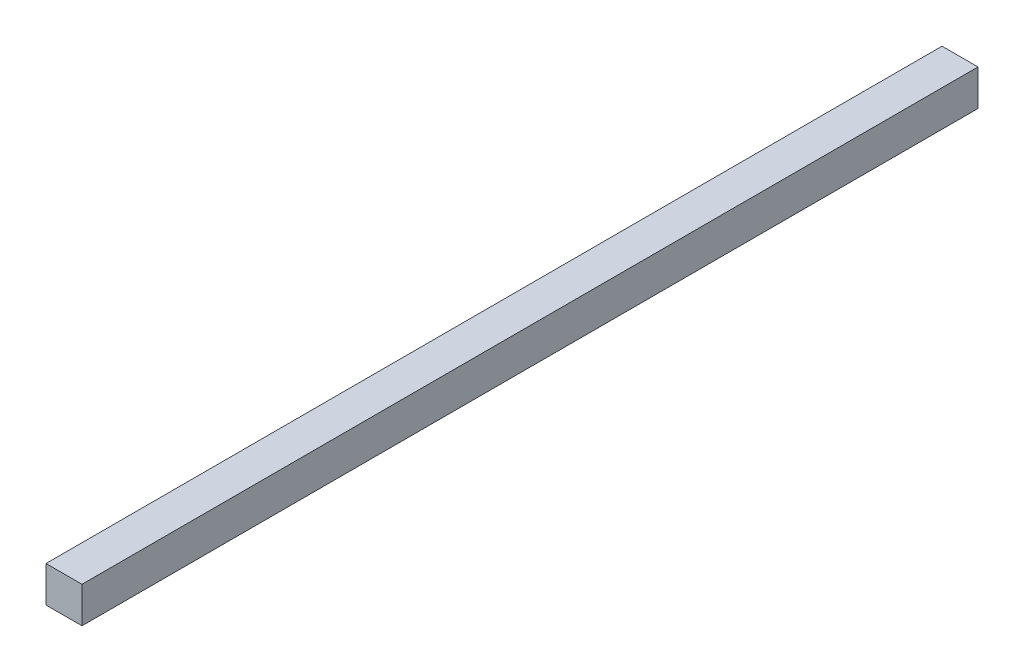
ISO-10303-21;
HEADER;
FILE_DESCRIPTION(('STEP AP214'),'2;1');
FILE_NAME('part.step','',(''),(''),'','','');
FILE_SCHEMA(('AUTOMOTIVE_DESIGN { 1 0 10303 214 1 1 1 1 }'));
ENDSEC;
DATA;
#1=APPLICATION_CONTEXT('core data for automotive mechanical design processes');
#2=APPLICATION_PROTOCOL_DEFINITION('international standard','automotive_design',2000,#1);
#3=PRODUCT_CONTEXT('',#1,'mechanical');
#4=PRODUCT('Part','Part','',(#3));
#5=PRODUCT_RELATED_PRODUCT_CATEGORY('part','',(#4));
#6=PRODUCT_DEFINITION_FORMATION('','',#4);
#7=PRODUCT_DEFINITION_CONTEXT('part definition',#1,'design');
#8=PRODUCT_DEFINITION('design','',#6,#7);
#9=PRODUCT_DEFINITION_SHAPE('','',#8);
#10=(LENGTH_UNIT() NAMED_UNIT(*) SI_UNIT(.MILLI.,.METRE.));
#11=(NAMED_UNIT(*) PLANE_ANGLE_UNIT() SI_UNIT($,.RADIAN.));
#12=(NAMED_UNIT(*) SI_UNIT($,.STERADIAN.) SOLID_ANGLE_UNIT());
#13=UNCERTAINTY_MEASURE_WITH_UNIT(LENGTH_MEASURE(1.E-05),#10,'distance_accuracy_value','');
#14=(GEOMETRIC_REPRESENTATION_CONTEXT(3) GLOBAL_UNCERTAINTY_ASSIGNED_CONTEXT((#13)) GLOBAL_UNIT_ASSIGNED_CONTEXT((#10,
#11,#12)) REPRESENTATION_CONTEXT('',''));
#15=CARTESIAN_POINT('',(0.,0.,0.));
#16=DIRECTION('',(0.,0.,1.));
#17=DIRECTION('',(1.,0.,0.));
#18=AXIS2_PLACEMENT_3D('',#15,#16,#17);
#19=CARTESIAN_POINT('',(12.7,12.7,632.46));
#20=DIRECTION('',(-1.,0.,0.));
#21=DIRECTION('',(0.,-1.,0.));
#22=AXIS2_PLACEMENT_3D('',#19,#20,#21);
#23=PLANE('',#22);
#24=DIRECTION('',(0.,1.,0.));
#25=VECTOR('',#24,1.);
#26=CARTESIAN_POINT('',(12.7,12.7,0.));
#27=LINE('',#26,#25);
#28=CARTESIAN_POINT('',(12.7,-12.7,0.));
#29=VERTEX_POINT('',#28);
#30=CARTESIAN_POINT('',(12.7,12.7,0.));
#31=VERTEX_POINT('',#30);
#32=EDGE_CURVE('E113',#29,#31,#27,.T.);
#33=ORIENTED_EDGE('',*,*,#32,.T.);
#34=DIRECTION('',(0.,0.,-1.));
#35=VECTOR('',#34,1.);
#36=CARTESIAN_POINT('',(12.7,12.7,632.46));
#37=LINE('',#36,#35);
#38=CARTESIAN_POINT('',(12.7,12.7,632.46));
#39=VERTEX_POINT('',#38);
#40=EDGE_CURVE('E11',#39,#31,#37,.T.);
#41=ORIENTED_EDGE('',*,*,#40,.F.);
#42=DIRECTION('',(0.,1.,0.));
#43=VECTOR('',#42,1.);
#44=CARTESIAN_POINT('',(12.7,12.7,632.46));
#45=LINE('',#44,#43);
#46=CARTESIAN_POINT('',(12.7,-12.7,632.46));
#47=VERTEX_POINT('',#46);
#48=EDGE_CURVE('E97',#47,#39,#45,.T.);
#49=ORIENTED_EDGE('',*,*,#48,.F.);
#50=DIRECTION('',(0.,0.,-1.));
#51=VECTOR('',#50,1.);
#52=CARTESIAN_POINT('',(12.7,-12.7,632.46));
#53=LINE('',#52,#51);
#54=EDGE_CURVE('E109',#47,#29,#53,.T.);
#55=ORIENTED_EDGE('',*,*,#54,.T.);
#56=EDGE_LOOP('',(#33,#41,#49,#55));
#57=FACE_BOUND('',#56,.T.);
#58=ADVANCED_FACE('F45',(#57),#23,.F.);
#59=CARTESIAN_POINT('',(-12.7,12.7,632.46));
#60=DIRECTION('',(0.,-1.,0.));
#61=DIRECTION('',(0.,0.,-1.));
#62=AXIS2_PLACEMENT_3D('',#59,#60,#61);
#63=PLANE('',#62);
#64=DIRECTION('',(-1.,0.,0.));
#65=VECTOR('',#64,1.);
#66=CARTESIAN_POINT('',(-12.7,12.7,0.));
#67=LINE('',#66,#65);
#68=CARTESIAN_POINT('',(-12.7,12.7,0.));
#69=VERTEX_POINT('',#68);
#70=EDGE_CURVE('E102',#31,#69,#67,.T.);
#71=ORIENTED_EDGE('',*,*,#70,.T.);
#72=DIRECTION('',(0.,0.,-1.));
#73=VECTOR('',#72,1.);
#74=CARTESIAN_POINT('',(-12.7,12.7,632.46));
#75=LINE('',#74,#73);
#76=CARTESIAN_POINT('',(-12.7,12.7,632.46));
#77=VERTEX_POINT('',#76);
#78=EDGE_CURVE('E54',#77,#69,#75,.T.);
#79=ORIENTED_EDGE('',*,*,#78,.F.);
#80=DIRECTION('',(-1.,0.,0.));
#81=VECTOR('',#80,1.);
#82=CARTESIAN_POINT('',(-12.7,12.7,632.46));
#83=LINE('',#82,#81);
#84=EDGE_CURVE('E92',#39,#77,#83,.T.);
#85=ORIENTED_EDGE('',*,*,#84,.F.);
#86=ORIENTED_EDGE('',*,*,#40,.T.);
#87=EDGE_LOOP('',(#71,#79,#85,#86));
#88=FACE_BOUND('',#87,.T.);
#89=ADVANCED_FACE('F101',(#88),#63,.F.);
#90=CARTESIAN_POINT('',(-12.7,12.7,632.46));
#91=DIRECTION('',(1.,0.,0.));
#92=DIRECTION('',(0.,1.,0.));
#93=AXIS2_PLACEMENT_3D('',#90,#91,#92);
#94=PLANE('',#93);
#95=DIRECTION('',(0.,-1.,0.));
#96=VECTOR('',#95,1.);
#97=CARTESIAN_POINT('',(-12.7,12.7,0.));
#98=LINE('',#97,#96);
#99=CARTESIAN_POINT('',(-12.7,-12.7,0.));
#100=VERTEX_POINT('',#99);
#101=EDGE_CURVE('E79',#69,#100,#98,.T.);
#102=ORIENTED_EDGE('',*,*,#101,.T.);
#103=DIRECTION('',(0.,0.,-1.));
#104=VECTOR('',#103,1.);
#105=CARTESIAN_POINT('',(-12.7,-12.7,632.46));
#106=LINE('',#105,#104);
#107=CARTESIAN_POINT('',(-12.7,-12.7,632.46));
#108=VERTEX_POINT('',#107);
#109=EDGE_CURVE('E104',#108,#100,#106,.T.);
#110=ORIENTED_EDGE('',*,*,#109,.F.);
#111=DIRECTION('',(0.,-1.,0.));
#112=VECTOR('',#111,1.);
#113=CARTESIAN_POINT('',(-12.7,12.7,632.46));
#114=LINE('',#113,#112);
#115=EDGE_CURVE('E95',#77,#108,#114,.T.);
#116=ORIENTED_EDGE('',*,*,#115,.F.);
#117=ORIENTED_EDGE('',*,*,#78,.T.);
#118=EDGE_LOOP('',(#102,#110,#116,#117));
#119=FACE_BOUND('',#118,.T.);
#120=ADVANCED_FACE('F105',(#119),#94,.F.);
#121=CARTESIAN_POINT('',(-12.7,-12.7,632.46));
#122=DIRECTION('',(0.,1.,0.));
#123=DIRECTION('',(0.,0.,1.));
#124=AXIS2_PLACEMENT_3D('',#121,#122,#123);
#125=PLANE('',#124);
#126=DIRECTION('',(1.,0.,0.));
#127=VECTOR('',#126,1.);
#128=CARTESIAN_POINT('',(-12.7,-12.7,0.));
#129=LINE('',#128,#127);
#130=EDGE_CURVE('E85',#100,#29,#129,.T.);
#131=ORIENTED_EDGE('',*,*,#130,.T.);
#132=ORIENTED_EDGE('',*,*,#54,.F.);
#133=DIRECTION('',(1.,0.,0.));
#134=VECTOR('',#133,1.);
#135=CARTESIAN_POINT('',(-12.7,-12.7,632.46));
#136=LINE('',#135,#134);
#137=EDGE_CURVE('E62',#108,#47,#136,.T.);
#138=ORIENTED_EDGE('',*,*,#137,.F.);
#139=ORIENTED_EDGE('',*,*,#109,.T.);
#140=EDGE_LOOP('',(#131,#132,#138,#139));
#141=FACE_BOUND('',#140,.T.);
#142=ADVANCED_FACE('F126',(#141),#125,.F.);
#143=CARTESIAN_POINT('',(0.,0.,632.46));
#144=DIRECTION('',(0.,0.,1.));
#145=DIRECTION('',(1.,0.,0.));
#146=AXIS2_PLACEMENT_3D('',#143,#144,#145);
#147=PLANE('',#146);
#148=ORIENTED_EDGE('',*,*,#48,.T.);
#149=ORIENTED_EDGE('',*,*,#84,.T.);
#150=ORIENTED_EDGE('',*,*,#115,.T.);
#151=ORIENTED_EDGE('',*,*,#137,.T.);
#152=EDGE_LOOP('',(#148,#149,#150,#151));
#153=FACE_BOUND('',#152,.T.);
#154=ADVANCED_FACE('F93',(#153),#147,.T.);
#155=CARTESIAN_POINT('',(0.,0.,0.));
#156=DIRECTION('',(0.,0.,1.));
#157=DIRECTION('',(1.,0.,0.));
#158=AXIS2_PLACEMENT_3D('',#155,#156,#157);
#159=PLANE('',#158);
#160=ORIENTED_EDGE('',*,*,#32,.F.);
#161=ORIENTED_EDGE('',*,*,#130,.F.);
#162=ORIENTED_EDGE('',*,*,#101,.F.);
#163=ORIENTED_EDGE('',*,*,#70,.F.);
#164=EDGE_LOOP('',(#160,#161,#162,#163));
#165=FACE_BOUND('',#164,.T.);
#166=ADVANCED_FACE('F129',(#165),#159,.F.);
#167=CLOSED_SHELL('',(#58,#89,#120,#142,#154,#166));
#168=MANIFOLD_SOLID_BREP('B2',#167);
#169=ADVANCED_BREP_SHAPE_REPRESENTATION('',(#18,#168),#14);
#170=SHAPE_DEFINITION_REPRESENTATION(#9,#169);
ENDSEC;
END-ISO-10303-21;
